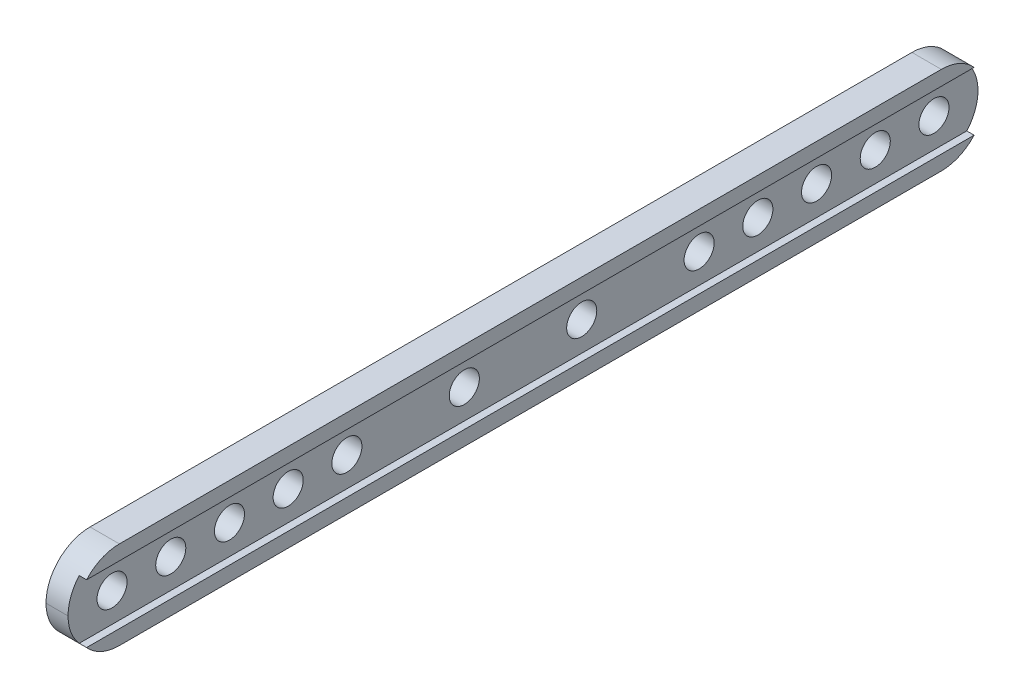
ISO-10303-21;
HEADER;
FILE_DESCRIPTION(('STEP AP214'),'2;1');
FILE_NAME('part.step','',(''),(''),'','','');
FILE_SCHEMA(('AUTOMOTIVE_DESIGN { 1 0 10303 214 1 1 1 1 }'));
ENDSEC;
DATA;
#1=APPLICATION_CONTEXT('core data for automotive mechanical design processes');
#2=APPLICATION_PROTOCOL_DEFINITION('international standard','automotive_design',2000,#1);
#3=PRODUCT_CONTEXT('',#1,'mechanical');
#4=PRODUCT('Part','Part','',(#3));
#5=PRODUCT_RELATED_PRODUCT_CATEGORY('part','',(#4));
#6=PRODUCT_DEFINITION_FORMATION('','',#4);
#7=PRODUCT_DEFINITION_CONTEXT('part definition',#1,'design');
#8=PRODUCT_DEFINITION('design','',#6,#7);
#9=PRODUCT_DEFINITION_SHAPE('','',#8);
#10=(LENGTH_UNIT() NAMED_UNIT(*) SI_UNIT(.MILLI.,.METRE.));
#11=(NAMED_UNIT(*) PLANE_ANGLE_UNIT() SI_UNIT($,.RADIAN.));
#12=(NAMED_UNIT(*) SI_UNIT($,.STERADIAN.) SOLID_ANGLE_UNIT());
#13=UNCERTAINTY_MEASURE_WITH_UNIT(LENGTH_MEASURE(1.E-05),#10,'distance_accuracy_value','');
#14=(GEOMETRIC_REPRESENTATION_CONTEXT(3) GLOBAL_UNCERTAINTY_ASSIGNED_CONTEXT((#13)) GLOBAL_UNIT_ASSIGNED_CONTEXT((#10,
#11,#12)) REPRESENTATION_CONTEXT('',''));
#15=CARTESIAN_POINT('',(0.,0.,0.));
#16=DIRECTION('',(0.,0.,1.));
#17=DIRECTION('',(1.,0.,0.));
#18=AXIS2_PLACEMENT_3D('',#15,#16,#17);
#19=CARTESIAN_POINT('',(4.,6.,-70.));
#20=DIRECTION('',(-1.,0.,0.));
#21=DIRECTION('',(0.,-1.,0.));
#22=AXIS2_PLACEMENT_3D('',#19,#20,#21);
#23=CYLINDRICAL_SURFACE('',#22,2.04999999999999);
#24=CARTESIAN_POINT('',(3.,6.,-70.));
#25=DIRECTION('',(1.,0.,0.));
#26=DIRECTION('',(0.,1.,0.));
#27=AXIS2_PLACEMENT_3D('',#24,#25,#26);
#28=CIRCLE('',#27,2.04999999999999);
#29=CARTESIAN_POINT('',(3.,8.04999999999999,-70.));
#30=VERTEX_POINT('',#29);
#31=EDGE_CURVE('E41',#30,#30,#28,.T.);
#32=ORIENTED_EDGE('',*,*,#31,.T.);
#33=EDGE_LOOP('',(#32));
#34=FACE_BOUND('',#33,.T.);
#35=CARTESIAN_POINT('',(0.,6.,-70.));
#36=DIRECTION('',(-1.,0.,0.));
#37=DIRECTION('',(0.,-1.,0.));
#38=AXIS2_PLACEMENT_3D('',#35,#36,#37);
#39=CIRCLE('',#38,2.04999999999999);
#40=CARTESIAN_POINT('',(0.,3.95000000000001,-70.));
#41=VERTEX_POINT('',#40);
#42=EDGE_CURVE('E11',#41,#41,#39,.T.);
#43=ORIENTED_EDGE('',*,*,#42,.T.);
#44=EDGE_LOOP('',(#43));
#45=FACE_BOUND('',#44,.T.);
#46=ADVANCED_FACE('F33',(#34,#45),#23,.F.);
#47=CARTESIAN_POINT('',(4.,6.,-86.));
#48=DIRECTION('',(-1.,0.,0.));
#49=DIRECTION('',(0.,-1.,0.));
#50=AXIS2_PLACEMENT_3D('',#47,#48,#49);
#51=CYLINDRICAL_SURFACE('',#50,2.04999999999999);
#52=CARTESIAN_POINT('',(3.,6.,-86.));
#53=DIRECTION('',(1.,0.,0.));
#54=DIRECTION('',(0.,1.,0.));
#55=AXIS2_PLACEMENT_3D('',#52,#53,#54);
#56=CIRCLE('',#55,2.04999999999999);
#57=CARTESIAN_POINT('',(3.,8.04999999999999,-86.));
#58=VERTEX_POINT('',#57);
#59=EDGE_CURVE('E191',#58,#58,#56,.T.);
#60=ORIENTED_EDGE('',*,*,#59,.T.);
#61=EDGE_LOOP('',(#60));
#62=FACE_BOUND('',#61,.T.);
#63=CARTESIAN_POINT('',(0.,6.,-86.));
#64=DIRECTION('',(-1.,0.,0.));
#65=DIRECTION('',(0.,-1.,0.));
#66=AXIS2_PLACEMENT_3D('',#63,#64,#65);
#67=CIRCLE('',#66,2.04999999999999);
#68=CARTESIAN_POINT('',(0.,3.95000000000001,-86.));
#69=VERTEX_POINT('',#68);
#70=EDGE_CURVE('E194',#69,#69,#67,.T.);
#71=ORIENTED_EDGE('',*,*,#70,.T.);
#72=EDGE_LOOP('',(#71));
#73=FACE_BOUND('',#72,.T.);
#74=ADVANCED_FACE('F279',(#62,#73),#51,.F.);
#75=CARTESIAN_POINT('',(4.,6.,-94.));
#76=DIRECTION('',(-1.,0.,0.));
#77=DIRECTION('',(0.,-1.,0.));
#78=AXIS2_PLACEMENT_3D('',#75,#76,#77);
#79=CYLINDRICAL_SURFACE('',#78,2.04999999999999);
#80=CARTESIAN_POINT('',(3.,6.,-94.));
#81=DIRECTION('',(1.,0.,0.));
#82=DIRECTION('',(0.,1.,0.));
#83=AXIS2_PLACEMENT_3D('',#80,#81,#82);
#84=CIRCLE('',#83,2.04999999999999);
#85=CARTESIAN_POINT('',(3.,8.04999999999999,-94.));
#86=VERTEX_POINT('',#85);
#87=EDGE_CURVE('E185',#86,#86,#84,.T.);
#88=ORIENTED_EDGE('',*,*,#87,.T.);
#89=EDGE_LOOP('',(#88));
#90=FACE_BOUND('',#89,.T.);
#91=CARTESIAN_POINT('',(0.,6.,-94.));
#92=DIRECTION('',(-1.,0.,0.));
#93=DIRECTION('',(0.,-1.,0.));
#94=AXIS2_PLACEMENT_3D('',#91,#92,#93);
#95=CIRCLE('',#94,2.04999999999999);
#96=CARTESIAN_POINT('',(0.,3.95000000000001,-94.));
#97=VERTEX_POINT('',#96);
#98=EDGE_CURVE('E188',#97,#97,#95,.T.);
#99=ORIENTED_EDGE('',*,*,#98,.T.);
#100=EDGE_LOOP('',(#99));
#101=FACE_BOUND('',#100,.T.);
#102=ADVANCED_FACE('F284',(#90,#101),#79,.F.);
#103=CARTESIAN_POINT('',(4.,6.,-102.));
#104=DIRECTION('',(-1.,0.,0.));
#105=DIRECTION('',(0.,-1.,0.));
#106=AXIS2_PLACEMENT_3D('',#103,#104,#105);
#107=CYLINDRICAL_SURFACE('',#106,2.04999999999999);
#108=CARTESIAN_POINT('',(3.,6.,-102.));
#109=DIRECTION('',(1.,0.,0.));
#110=DIRECTION('',(0.,1.,0.));
#111=AXIS2_PLACEMENT_3D('',#108,#109,#110);
#112=CIRCLE('',#111,2.04999999999999);
#113=CARTESIAN_POINT('',(3.,8.04999999999999,-102.));
#114=VERTEX_POINT('',#113);
#115=EDGE_CURVE('E172',#114,#114,#112,.T.);
#116=ORIENTED_EDGE('',*,*,#115,.T.);
#117=EDGE_LOOP('',(#116));
#118=FACE_BOUND('',#117,.T.);
#119=CARTESIAN_POINT('',(0.,6.,-102.));
#120=DIRECTION('',(-1.,0.,0.));
#121=DIRECTION('',(0.,-1.,0.));
#122=AXIS2_PLACEMENT_3D('',#119,#120,#121);
#123=CIRCLE('',#122,2.04999999999999);
#124=CARTESIAN_POINT('',(0.,3.95000000000001,-102.));
#125=VERTEX_POINT('',#124);
#126=EDGE_CURVE('E182',#125,#125,#123,.T.);
#127=ORIENTED_EDGE('',*,*,#126,.T.);
#128=EDGE_LOOP('',(#127));
#129=FACE_BOUND('',#128,.T.);
#130=ADVANCED_FACE('F292',(#118,#129),#107,.F.);
#131=CARTESIAN_POINT('',(0.,0.,-124.));
#132=DIRECTION('',(-1.,0.,0.));
#133=DIRECTION('',(0.,-1.,0.));
#134=AXIS2_PLACEMENT_3D('',#131,#132,#133);
#135=PLANE('',#134);
#136=CARTESIAN_POINT('',(0.,6.,-22.));
#137=DIRECTION('',(1.,0.,0.));
#138=DIRECTION('',(0.,-1.,0.));
#139=AXIS2_PLACEMENT_3D('',#136,#137,#138);
#140=CIRCLE('',#139,2.04999999999999);
#141=CARTESIAN_POINT('',(0.,3.95000000000001,-22.));
#142=VERTEX_POINT('',#141);
#143=EDGE_CURVE('E212',#142,#142,#140,.T.);
#144=ORIENTED_EDGE('',*,*,#143,.T.);
#145=EDGE_LOOP('',(#144));
#146=FACE_BOUND('',#145,.T.);
#147=CARTESIAN_POINT('',(0.,6.,-30.));
#148=DIRECTION('',(1.,0.,0.));
#149=DIRECTION('',(0.,-1.,0.));
#150=AXIS2_PLACEMENT_3D('',#147,#148,#149);
#151=CIRCLE('',#150,2.04999999999999);
#152=CARTESIAN_POINT('',(0.,3.95000000000001,-30.));
#153=VERTEX_POINT('',#152);
#154=EDGE_CURVE('E365',#153,#153,#151,.T.);
#155=ORIENTED_EDGE('',*,*,#154,.T.);
#156=EDGE_LOOP('',(#155));
#157=FACE_BOUND('',#156,.T.);
#158=CARTESIAN_POINT('',(0.,6.,-38.));
#159=DIRECTION('',(1.,0.,0.));
#160=DIRECTION('',(0.,-1.,0.));
#161=AXIS2_PLACEMENT_3D('',#158,#159,#160);
#162=CIRCLE('',#161,2.04999999999999);
#163=CARTESIAN_POINT('',(0.,3.95000000000001,-38.));
#164=VERTEX_POINT('',#163);
#165=EDGE_CURVE('E368',#164,#164,#162,.T.);
#166=ORIENTED_EDGE('',*,*,#165,.T.);
#167=EDGE_LOOP('',(#166));
#168=FACE_BOUND('',#167,.T.);
#169=CARTESIAN_POINT('',(0.,6.,-54.));
#170=DIRECTION('',(1.,0.,0.));
#171=DIRECTION('',(0.,-1.,0.));
#172=AXIS2_PLACEMENT_3D('',#169,#170,#171);
#173=CIRCLE('',#172,2.04999999999999);
#174=CARTESIAN_POINT('',(0.,3.95000000000001,-54.));
#175=VERTEX_POINT('',#174);
#176=EDGE_CURVE('E227',#175,#175,#173,.T.);
#177=ORIENTED_EDGE('',*,*,#176,.T.);
#178=EDGE_LOOP('',(#177));
#179=FACE_BOUND('',#178,.T.);
#180=CARTESIAN_POINT('',(0.,6.,-14.));
#181=DIRECTION('',(1.,0.,0.));
#182=DIRECTION('',(0.,-1.,0.));
#183=AXIS2_PLACEMENT_3D('',#180,#181,#182);
#184=CIRCLE('',#183,2.04999999999999);
#185=CARTESIAN_POINT('',(0.,3.95000000000001,-14.));
#186=VERTEX_POINT('',#185);
#187=EDGE_CURVE('E207',#186,#186,#184,.T.);
#188=ORIENTED_EDGE('',*,*,#187,.T.);
#189=EDGE_LOOP('',(#188));
#190=FACE_BOUND('',#189,.T.);
#191=CARTESIAN_POINT('',(0.,6.,-6.00000000000001));
#192=DIRECTION('',(1.,0.,0.));
#193=DIRECTION('',(0.,-1.,0.));
#194=AXIS2_PLACEMENT_3D('',#191,#192,#193);
#195=CIRCLE('',#194,2.04999999999999);
#196=CARTESIAN_POINT('',(0.,3.95000000000001,-6.00000000000001));
#197=VERTEX_POINT('',#196);
#198=EDGE_CURVE('E203',#197,#197,#195,.T.);
#199=ORIENTED_EDGE('',*,*,#198,.T.);
#200=EDGE_LOOP('',(#199));
#201=FACE_BOUND('',#200,.T.);
#202=CARTESIAN_POINT('',(0.,6.,-110.));
#203=DIRECTION('',(-1.,0.,0.));
#204=DIRECTION('',(0.,-1.,0.));
#205=AXIS2_PLACEMENT_3D('',#202,#203,#204);
#206=CIRCLE('',#205,2.04999999999999);
#207=CARTESIAN_POINT('',(0.,3.95000000000001,-110.));
#208=VERTEX_POINT('',#207);
#209=EDGE_CURVE('E233',#208,#208,#206,.T.);
#210=ORIENTED_EDGE('',*,*,#209,.F.);
#211=EDGE_LOOP('',(#210));
#212=FACE_BOUND('',#211,.T.);
#213=CARTESIAN_POINT('',(0.,6.,-118.));
#214=DIRECTION('',(-1.,0.,0.));
#215=DIRECTION('',(0.,-1.,0.));
#216=AXIS2_PLACEMENT_3D('',#213,#214,#215);
#217=CIRCLE('',#216,2.04999999999999);
#218=CARTESIAN_POINT('',(0.,3.95000000000001,-118.));
#219=VERTEX_POINT('',#218);
#220=EDGE_CURVE('E179',#219,#219,#217,.T.);
#221=ORIENTED_EDGE('',*,*,#220,.F.);
#222=EDGE_LOOP('',(#221));
#223=FACE_BOUND('',#222,.T.);
#224=CARTESIAN_POINT('',(0.,6.,-6.));
#225=DIRECTION('',(-1.,0.,0.));
#226=DIRECTION('',(0.,-1.,0.));
#227=AXIS2_PLACEMENT_3D('',#224,#225,#226);
#228=CIRCLE('',#227,6.);
#229=CARTESIAN_POINT('',(0.,0.,-6.00000000000001));
#230=VERTEX_POINT('',#229);
#231=CARTESIAN_POINT('',(0.,6.,0.));
#232=VERTEX_POINT('',#231);
#233=EDGE_CURVE('E114',#230,#232,#228,.T.);
#234=ORIENTED_EDGE('',*,*,#233,.T.);
#235=CARTESIAN_POINT('',(0.,6.,-6.));
#236=DIRECTION('',(-1.,0.,0.));
#237=DIRECTION('',(0.,-1.,0.));
#238=AXIS2_PLACEMENT_3D('',#235,#236,#237);
#239=CIRCLE('',#238,6.);
#240=CARTESIAN_POINT('',(0.,12.,-6.00000000000001));
#241=VERTEX_POINT('',#240);
#242=EDGE_CURVE('E120',#232,#241,#239,.T.);
#243=ORIENTED_EDGE('',*,*,#242,.T.);
#244=DIRECTION('',(0.,0.,1.));
#245=VECTOR('',#244,1.);
#246=CARTESIAN_POINT('',(0.,12.,-124.));
#247=LINE('',#246,#245);
#248=CARTESIAN_POINT('',(0.,12.,-118.));
#249=VERTEX_POINT('',#248);
#250=EDGE_CURVE('E238',#249,#241,#247,.T.);
#251=ORIENTED_EDGE('',*,*,#250,.F.);
#252=CARTESIAN_POINT('',(0.,6.,-118.));
#253=DIRECTION('',(-1.,0.,0.));
#254=DIRECTION('',(0.,-1.,0.));
#255=AXIS2_PLACEMENT_3D('',#252,#253,#254);
#256=CIRCLE('',#255,6.);
#257=CARTESIAN_POINT('',(0.,6.,-124.));
#258=VERTEX_POINT('',#257);
#259=EDGE_CURVE('E240',#249,#258,#256,.T.);
#260=ORIENTED_EDGE('',*,*,#259,.T.);
#261=CARTESIAN_POINT('',(0.,6.,-118.));
#262=DIRECTION('',(-1.,0.,0.));
#263=DIRECTION('',(0.,-1.,0.));
#264=AXIS2_PLACEMENT_3D('',#261,#262,#263);
#265=CIRCLE('',#264,6.);
#266=CARTESIAN_POINT('',(0.,0.,-118.));
#267=VERTEX_POINT('',#266);
#268=EDGE_CURVE('E126',#258,#267,#265,.T.);
#269=ORIENTED_EDGE('',*,*,#268,.T.);
#270=DIRECTION('',(0.,0.,1.));
#271=VECTOR('',#270,1.);
#272=CARTESIAN_POINT('',(0.,0.,-124.));
#273=LINE('',#272,#271);
#274=EDGE_CURVE('E123',#267,#230,#273,.T.);
#275=ORIENTED_EDGE('',*,*,#274,.T.);
#276=EDGE_LOOP('',(#234,#243,#251,#260,#269,#275));
#277=FACE_BOUND('',#276,.T.);
#278=ORIENTED_EDGE('',*,*,#126,.F.);
#279=EDGE_LOOP('',(#278));
#280=FACE_BOUND('',#279,.T.);
#281=ORIENTED_EDGE('',*,*,#98,.F.);
#282=EDGE_LOOP('',(#281));
#283=FACE_BOUND('',#282,.T.);
#284=ORIENTED_EDGE('',*,*,#70,.F.);
#285=EDGE_LOOP('',(#284));
#286=FACE_BOUND('',#285,.T.);
#287=ORIENTED_EDGE('',*,*,#42,.F.);
#288=EDGE_LOOP('',(#287));
#289=FACE_BOUND('',#288,.T.);
#290=ADVANCED_FACE('F116',(#146,#157,#168,#179,#190,#201,#212,#223,#277,#280,#283,#286,#289),
#135,.T.);
#291=CARTESIAN_POINT('',(0.,12.,-124.));
#292=DIRECTION('',(0.,1.,0.));
#293=DIRECTION('',(0.,0.,1.));
#294=AXIS2_PLACEMENT_3D('',#291,#292,#293);
#295=PLANE('',#294);
#296=ORIENTED_EDGE('',*,*,#250,.T.);
#297=DIRECTION('',(-1.,0.,0.));
#298=VECTOR('',#297,1.);
#299=CARTESIAN_POINT('',(4.,12.,-6.));
#300=LINE('',#299,#298);
#301=CARTESIAN_POINT('',(4.,12.,-6.00000000000001));
#302=VERTEX_POINT('',#301);
#303=EDGE_CURVE('E141',#241,#302,#300,.F.);
#304=ORIENTED_EDGE('',*,*,#303,.T.);
#305=DIRECTION('',(0.,0.,1.));
#306=VECTOR('',#305,1.);
#307=CARTESIAN_POINT('',(4.,12.,-124.));
#308=LINE('',#307,#306);
#309=CARTESIAN_POINT('',(4.,12.,-118.));
#310=VERTEX_POINT('',#309);
#311=EDGE_CURVE('E241',#310,#302,#308,.T.);
#312=ORIENTED_EDGE('',*,*,#311,.F.);
#313=DIRECTION('',(-1.,0.,0.));
#314=VECTOR('',#313,1.);
#315=CARTESIAN_POINT('',(0.,12.,-118.));
#316=LINE('',#315,#314);
#317=EDGE_CURVE('E142',#310,#249,#316,.T.);
#318=ORIENTED_EDGE('',*,*,#317,.T.);
#319=EDGE_LOOP('',(#296,#304,#312,#318));
#320=FACE_BOUND('',#319,.T.);
#321=ADVANCED_FACE('F291',(#320),#295,.T.);
#322=CARTESIAN_POINT('',(4.,10.,-124.));
#323=DIRECTION('',(1.,0.,0.));
#324=DIRECTION('',(0.,1.,0.));
#325=AXIS2_PLACEMENT_3D('',#322,#323,#324);
#326=PLANE('',#325);
#327=ORIENTED_EDGE('',*,*,#311,.T.);
#328=CARTESIAN_POINT('',(4.,6.,-6.));
#329=DIRECTION('',(1.,0.,0.));
#330=DIRECTION('',(0.,1.,0.));
#331=AXIS2_PLACEMENT_3D('',#328,#329,#330);
#332=CIRCLE('',#331,6.);
#333=CARTESIAN_POINT('',(4.,10.,-1.52786404500042));
#334=VERTEX_POINT('',#333);
#335=EDGE_CURVE('E150',#302,#334,#332,.T.);
#336=ORIENTED_EDGE('',*,*,#335,.T.);
#337=DIRECTION('',(0.,0.,1.));
#338=VECTOR('',#337,1.);
#339=CARTESIAN_POINT('',(4.,10.,-124.));
#340=LINE('',#339,#338);
#341=CARTESIAN_POINT('',(4.,10.,-122.472135955));
#342=VERTEX_POINT('',#341);
#343=EDGE_CURVE('E244',#342,#334,#340,.T.);
#344=ORIENTED_EDGE('',*,*,#343,.F.);
#345=CARTESIAN_POINT('',(4.,6.,-118.));
#346=DIRECTION('',(1.,0.,0.));
#347=DIRECTION('',(0.,1.,0.));
#348=AXIS2_PLACEMENT_3D('',#345,#346,#347);
#349=CIRCLE('',#348,6.);
#350=EDGE_CURVE('E148',#342,#310,#349,.T.);
#351=ORIENTED_EDGE('',*,*,#350,.T.);
#352=EDGE_LOOP('',(#327,#336,#344,#351));
#353=FACE_BOUND('',#352,.T.);
#354=ADVANCED_FACE('F299',(#353),#326,.T.);
#355=CARTESIAN_POINT('',(4.,10.,-124.));
#356=DIRECTION('',(0.,-1.,0.));
#357=DIRECTION('',(1.,0.,0.));
#358=AXIS2_PLACEMENT_3D('',#355,#356,#357);
#359=PLANE('',#358);
#360=ORIENTED_EDGE('',*,*,#343,.T.);
#361=DIRECTION('',(1.,0.,0.));
#362=VECTOR('',#361,1.);
#363=CARTESIAN_POINT('',(4.,10.,-1.52786404500043));
#364=LINE('',#363,#362);
#365=CARTESIAN_POINT('',(3.,10.,-1.52786404500042));
#366=VERTEX_POINT('',#365);
#367=EDGE_CURVE('E154',#334,#366,#364,.F.);
#368=ORIENTED_EDGE('',*,*,#367,.T.);
#369=DIRECTION('',(0.,0.,1.));
#370=VECTOR('',#369,1.);
#371=CARTESIAN_POINT('',(3.,10.,-124.));
#372=LINE('',#371,#370);
#373=CARTESIAN_POINT('',(3.,10.,-122.472135955));
#374=VERTEX_POINT('',#373);
#375=EDGE_CURVE('E247',#374,#366,#372,.T.);
#376=ORIENTED_EDGE('',*,*,#375,.F.);
#377=DIRECTION('',(-1.,0.,0.));
#378=VECTOR('',#377,1.);
#379=CARTESIAN_POINT('',(3.,10.,-122.472135955));
#380=LINE('',#379,#378);
#381=EDGE_CURVE('E152',#374,#342,#380,.F.);
#382=ORIENTED_EDGE('',*,*,#381,.T.);
#383=EDGE_LOOP('',(#360,#368,#376,#382));
#384=FACE_BOUND('',#383,.T.);
#385=ADVANCED_FACE('F328',(#384),#359,.T.);
#386=CARTESIAN_POINT('',(3.,10.,-124.));
#387=DIRECTION('',(1.,0.,0.));
#388=DIRECTION('',(0.,1.,0.));
#389=AXIS2_PLACEMENT_3D('',#386,#387,#388);
#390=PLANE('',#389);
#391=CARTESIAN_POINT('',(3.,6.,-22.));
#392=DIRECTION('',(1.,0.,0.));
#393=DIRECTION('',(0.,1.,0.));
#394=AXIS2_PLACEMENT_3D('',#391,#392,#393);
#395=CIRCLE('',#394,2.04999999999999);
#396=CARTESIAN_POINT('',(3.,8.04999999999999,-22.));
#397=VERTEX_POINT('',#396);
#398=EDGE_CURVE('E36',#397,#397,#395,.F.);
#399=ORIENTED_EDGE('',*,*,#398,.T.);
#400=EDGE_LOOP('',(#399));
#401=FACE_BOUND('',#400,.T.);
#402=CARTESIAN_POINT('',(3.,6.,-30.));
#403=DIRECTION('',(1.,0.,0.));
#404=DIRECTION('',(0.,1.,0.));
#405=AXIS2_PLACEMENT_3D('',#402,#403,#404);
#406=CIRCLE('',#405,2.04999999999999);
#407=CARTESIAN_POINT('',(3.,8.04999999999999,-30.));
#408=VERTEX_POINT('',#407);
#409=EDGE_CURVE('E214',#408,#408,#406,.F.);
#410=ORIENTED_EDGE('',*,*,#409,.T.);
#411=EDGE_LOOP('',(#410));
#412=FACE_BOUND('',#411,.T.);
#413=CARTESIAN_POINT('',(3.,6.,-38.));
#414=DIRECTION('',(1.,0.,0.));
#415=DIRECTION('',(0.,1.,0.));
#416=AXIS2_PLACEMENT_3D('',#413,#414,#415);
#417=CIRCLE('',#416,2.04999999999999);
#418=CARTESIAN_POINT('',(3.,8.04999999999999,-38.));
#419=VERTEX_POINT('',#418);
#420=EDGE_CURVE('E211',#419,#419,#417,.F.);
#421=ORIENTED_EDGE('',*,*,#420,.T.);
#422=EDGE_LOOP('',(#421));
#423=FACE_BOUND('',#422,.T.);
#424=CARTESIAN_POINT('',(3.,6.,-54.));
#425=DIRECTION('',(1.,0.,0.));
#426=DIRECTION('',(0.,1.,0.));
#427=AXIS2_PLACEMENT_3D('',#424,#425,#426);
#428=CIRCLE('',#427,2.04999999999999);
#429=CARTESIAN_POINT('',(3.,8.04999999999999,-54.));
#430=VERTEX_POINT('',#429);
#431=EDGE_CURVE('E208',#430,#430,#428,.F.);
#432=ORIENTED_EDGE('',*,*,#431,.T.);
#433=EDGE_LOOP('',(#432));
#434=FACE_BOUND('',#433,.T.);
#435=CARTESIAN_POINT('',(3.,6.,-14.));
#436=DIRECTION('',(1.,0.,0.));
#437=DIRECTION('',(0.,1.,0.));
#438=AXIS2_PLACEMENT_3D('',#435,#436,#437);
#439=CIRCLE('',#438,2.04999999999999);
#440=CARTESIAN_POINT('',(3.,8.04999999999999,-14.));
#441=VERTEX_POINT('',#440);
#442=EDGE_CURVE('E204',#441,#441,#439,.F.);
#443=ORIENTED_EDGE('',*,*,#442,.T.);
#444=EDGE_LOOP('',(#443));
#445=FACE_BOUND('',#444,.T.);
#446=CARTESIAN_POINT('',(3.,6.,-6.00000000000001));
#447=DIRECTION('',(1.,0.,0.));
#448=DIRECTION('',(0.,1.,0.));
#449=AXIS2_PLACEMENT_3D('',#446,#447,#448);
#450=CIRCLE('',#449,2.04999999999999);
#451=CARTESIAN_POINT('',(3.,8.04999999999999,-6.00000000000001));
#452=VERTEX_POINT('',#451);
#453=EDGE_CURVE('E199',#452,#452,#450,.F.);
#454=ORIENTED_EDGE('',*,*,#453,.T.);
#455=EDGE_LOOP('',(#454));
#456=FACE_BOUND('',#455,.T.);
#457=CARTESIAN_POINT('',(3.,6.,-110.));
#458=DIRECTION('',(1.,0.,0.));
#459=DIRECTION('',(0.,1.,0.));
#460=AXIS2_PLACEMENT_3D('',#457,#458,#459);
#461=CIRCLE('',#460,2.04999999999999);
#462=CARTESIAN_POINT('',(3.,8.04999999999999,-110.));
#463=VERTEX_POINT('',#462);
#464=EDGE_CURVE('E202',#463,#463,#461,.T.);
#465=ORIENTED_EDGE('',*,*,#464,.F.);
#466=EDGE_LOOP('',(#465));
#467=FACE_BOUND('',#466,.T.);
#468=CARTESIAN_POINT('',(3.,6.,-118.));
#469=DIRECTION('',(1.,0.,0.));
#470=DIRECTION('',(0.,1.,0.));
#471=AXIS2_PLACEMENT_3D('',#468,#469,#470);
#472=CIRCLE('',#471,2.04999999999999);
#473=CARTESIAN_POINT('',(3.,8.04999999999999,-118.));
#474=VERTEX_POINT('',#473);
#475=EDGE_CURVE('E176',#474,#474,#472,.T.);
#476=ORIENTED_EDGE('',*,*,#475,.F.);
#477=EDGE_LOOP('',(#476));
#478=FACE_BOUND('',#477,.T.);
#479=ORIENTED_EDGE('',*,*,#375,.T.);
#480=CARTESIAN_POINT('',(3.,6.,-6.));
#481=DIRECTION('',(1.,0.,0.));
#482=DIRECTION('',(0.,1.,0.));
#483=AXIS2_PLACEMENT_3D('',#480,#481,#482);
#484=CIRCLE('',#483,6.);
#485=CARTESIAN_POINT('',(3.,6.,0.));
#486=VERTEX_POINT('',#485);
#487=EDGE_CURVE('E161',#366,#486,#484,.T.);
#488=ORIENTED_EDGE('',*,*,#487,.T.);
#489=CARTESIAN_POINT('',(3.,6.,-6.));
#490=DIRECTION('',(1.,0.,0.));
#491=DIRECTION('',(0.,1.,0.));
#492=AXIS2_PLACEMENT_3D('',#489,#490,#491);
#493=CIRCLE('',#492,6.);
#494=CARTESIAN_POINT('',(3.,2.,-1.52786404500042));
#495=VERTEX_POINT('',#494);
#496=EDGE_CURVE('E133',#486,#495,#493,.T.);
#497=ORIENTED_EDGE('',*,*,#496,.T.);
#498=DIRECTION('',(0.,0.,1.));
#499=VECTOR('',#498,1.);
#500=CARTESIAN_POINT('',(3.,2.,-124.));
#501=LINE('',#500,#499);
#502=CARTESIAN_POINT('',(3.,2.,-122.472135955));
#503=VERTEX_POINT('',#502);
#504=EDGE_CURVE('E250',#503,#495,#501,.T.);
#505=ORIENTED_EDGE('',*,*,#504,.F.);
#506=CARTESIAN_POINT('',(3.,6.,-118.));
#507=DIRECTION('',(1.,0.,0.));
#508=DIRECTION('',(0.,1.,0.));
#509=AXIS2_PLACEMENT_3D('',#506,#507,#508);
#510=CIRCLE('',#509,6.);
#511=CARTESIAN_POINT('',(3.,6.,-124.));
#512=VERTEX_POINT('',#511);
#513=EDGE_CURVE('E158',#503,#512,#510,.T.);
#514=ORIENTED_EDGE('',*,*,#513,.T.);
#515=CARTESIAN_POINT('',(3.,6.,-118.));
#516=DIRECTION('',(1.,0.,0.));
#517=DIRECTION('',(0.,1.,0.));
#518=AXIS2_PLACEMENT_3D('',#515,#516,#517);
#519=CIRCLE('',#518,6.);
#520=EDGE_CURVE('E156',#512,#374,#519,.T.);
#521=ORIENTED_EDGE('',*,*,#520,.T.);
#522=EDGE_LOOP('',(#479,#488,#497,#505,#514,#521));
#523=FACE_BOUND('',#522,.T.);
#524=ORIENTED_EDGE('',*,*,#115,.F.);
#525=EDGE_LOOP('',(#524));
#526=FACE_BOUND('',#525,.T.);
#527=ORIENTED_EDGE('',*,*,#87,.F.);
#528=EDGE_LOOP('',(#527));
#529=FACE_BOUND('',#528,.T.);
#530=ORIENTED_EDGE('',*,*,#59,.F.);
#531=EDGE_LOOP('',(#530));
#532=FACE_BOUND('',#531,.T.);
#533=ORIENTED_EDGE('',*,*,#31,.F.);
#534=EDGE_LOOP('',(#533));
#535=FACE_BOUND('',#534,.T.);
#536=ADVANCED_FACE('F322',(#401,#412,#423,#434,#445,#456,#467,#478,#523,#526,#529,#532,#535),
#390,.T.);
#537=CARTESIAN_POINT('',(4.,2.,-124.));
#538=DIRECTION('',(0.,1.,0.));
#539=DIRECTION('',(-1.,0.,0.));
#540=AXIS2_PLACEMENT_3D('',#537,#538,#539);
#541=PLANE('',#540);
#542=ORIENTED_EDGE('',*,*,#504,.T.);
#543=DIRECTION('',(-1.,0.,0.));
#544=VECTOR('',#543,1.);
#545=CARTESIAN_POINT('',(3.,2.,-1.52786404500043));
#546=LINE('',#545,#544);
#547=CARTESIAN_POINT('',(4.,2.,-1.52786404500042));
#548=VERTEX_POINT('',#547);
#549=EDGE_CURVE('E165',#495,#548,#546,.F.);
#550=ORIENTED_EDGE('',*,*,#549,.T.);
#551=DIRECTION('',(0.,0.,1.));
#552=VECTOR('',#551,1.);
#553=CARTESIAN_POINT('',(4.,2.,-124.));
#554=LINE('',#553,#552);
#555=CARTESIAN_POINT('',(4.,2.,-122.472135955));
#556=VERTEX_POINT('',#555);
#557=EDGE_CURVE('E253',#556,#548,#554,.T.);
#558=ORIENTED_EDGE('',*,*,#557,.F.);
#559=DIRECTION('',(1.,0.,0.));
#560=VECTOR('',#559,1.);
#561=CARTESIAN_POINT('',(4.,2.,-122.472135955));
#562=LINE('',#561,#560);
#563=EDGE_CURVE('E163',#556,#503,#562,.F.);
#564=ORIENTED_EDGE('',*,*,#563,.T.);
#565=EDGE_LOOP('',(#542,#550,#558,#564));
#566=FACE_BOUND('',#565,.T.);
#567=ADVANCED_FACE('F318',(#566),#541,.T.);
#568=CARTESIAN_POINT('',(4.,0.,-124.));
#569=DIRECTION('',(1.,0.,0.));
#570=DIRECTION('',(0.,1.,0.));
#571=AXIS2_PLACEMENT_3D('',#568,#569,#570);
#572=PLANE('',#571);
#573=ORIENTED_EDGE('',*,*,#557,.T.);
#574=CARTESIAN_POINT('',(4.,6.,-6.));
#575=DIRECTION('',(1.,0.,0.));
#576=DIRECTION('',(0.,1.,0.));
#577=AXIS2_PLACEMENT_3D('',#574,#575,#576);
#578=CIRCLE('',#577,6.);
#579=CARTESIAN_POINT('',(4.,0.,-6.00000000000001));
#580=VERTEX_POINT('',#579);
#581=EDGE_CURVE('E49',#548,#580,#578,.T.);
#582=ORIENTED_EDGE('',*,*,#581,.T.);
#583=DIRECTION('',(0.,0.,1.));
#584=VECTOR('',#583,1.);
#585=CARTESIAN_POINT('',(4.,0.,-124.));
#586=LINE('',#585,#584);
#587=CARTESIAN_POINT('',(4.,0.,-118.));
#588=VERTEX_POINT('',#587);
#589=EDGE_CURVE('E255',#588,#580,#586,.T.);
#590=ORIENTED_EDGE('',*,*,#589,.F.);
#591=CARTESIAN_POINT('',(4.,6.,-118.));
#592=DIRECTION('',(1.,0.,0.));
#593=DIRECTION('',(0.,1.,0.));
#594=AXIS2_PLACEMENT_3D('',#591,#592,#593);
#595=CIRCLE('',#594,6.);
#596=EDGE_CURVE('E57',#588,#556,#595,.T.);
#597=ORIENTED_EDGE('',*,*,#596,.T.);
#598=EDGE_LOOP('',(#573,#582,#590,#597));
#599=FACE_BOUND('',#598,.T.);
#600=ADVANCED_FACE('F314',(#599),#572,.T.);
#601=CARTESIAN_POINT('',(0.,0.,-124.));
#602=DIRECTION('',(0.,-1.,0.));
#603=DIRECTION('',(0.,0.,-1.));
#604=AXIS2_PLACEMENT_3D('',#601,#602,#603);
#605=PLANE('',#604);
#606=ORIENTED_EDGE('',*,*,#589,.T.);
#607=DIRECTION('',(1.,0.,0.));
#608=VECTOR('',#607,1.);
#609=CARTESIAN_POINT('',(0.,0.,-6.));
#610=LINE('',#609,#608);
#611=EDGE_CURVE('E171',#580,#230,#610,.F.);
#612=ORIENTED_EDGE('',*,*,#611,.T.);
#613=ORIENTED_EDGE('',*,*,#274,.F.);
#614=DIRECTION('',(1.,0.,0.));
#615=VECTOR('',#614,1.);
#616=CARTESIAN_POINT('',(0.,0.,-118.));
#617=LINE('',#616,#615);
#618=EDGE_CURVE('E169',#267,#588,#617,.T.);
#619=ORIENTED_EDGE('',*,*,#618,.T.);
#620=EDGE_LOOP('',(#606,#612,#613,#619));
#621=FACE_BOUND('',#620,.T.);
#622=ADVANCED_FACE('F262',(#621),#605,.T.);
#623=CARTESIAN_POINT('',(0.,6.,-6.));
#624=DIRECTION('',(-1.,0.,0.));
#625=DIRECTION('',(0.,0.,1.));
#626=AXIS2_PLACEMENT_3D('',#623,#624,#625);
#627=CYLINDRICAL_SURFACE('',#626,6.);
#628=ORIENTED_EDGE('',*,*,#549,.F.);
#629=ORIENTED_EDGE('',*,*,#496,.F.);
#630=DIRECTION('',(1.,0.,0.));
#631=VECTOR('',#630,1.);
#632=CARTESIAN_POINT('',(4.,6.,0.));
#633=LINE('',#632,#631);
#634=EDGE_CURVE('E130',#232,#486,#633,.T.);
#635=ORIENTED_EDGE('',*,*,#634,.F.);
#636=ORIENTED_EDGE('',*,*,#233,.F.);
#637=ORIENTED_EDGE('',*,*,#611,.F.);
#638=ORIENTED_EDGE('',*,*,#581,.F.);
#639=EDGE_LOOP('',(#628,#629,#635,#636,#637,#638));
#640=FACE_BOUND('',#639,.T.);
#641=ADVANCED_FACE('F132',(#640),#627,.T.);
#642=CARTESIAN_POINT('',(0.,6.,-6.));
#643=DIRECTION('',(1.,0.,0.));
#644=DIRECTION('',(0.,0.,-1.));
#645=AXIS2_PLACEMENT_3D('',#642,#643,#644);
#646=CYLINDRICAL_SURFACE('',#645,6.);
#647=ORIENTED_EDGE('',*,*,#335,.F.);
#648=ORIENTED_EDGE('',*,*,#303,.F.);
#649=ORIENTED_EDGE('',*,*,#242,.F.);
#650=ORIENTED_EDGE('',*,*,#634,.T.);
#651=ORIENTED_EDGE('',*,*,#487,.F.);
#652=ORIENTED_EDGE('',*,*,#367,.F.);
#653=EDGE_LOOP('',(#647,#648,#649,#650,#651,#652));
#654=FACE_BOUND('',#653,.T.);
#655=ADVANCED_FACE('F139',(#654),#646,.T.);
#656=CARTESIAN_POINT('',(0.,6.,-118.));
#657=DIRECTION('',(-1.,0.,0.));
#658=DIRECTION('',(0.,0.,1.));
#659=AXIS2_PLACEMENT_3D('',#656,#657,#658);
#660=CYLINDRICAL_SURFACE('',#659,6.);
#661=DIRECTION('',(-1.,0.,0.));
#662=VECTOR('',#661,1.);
#663=CARTESIAN_POINT('',(0.,6.,-124.));
#664=LINE('',#663,#662);
#665=EDGE_CURVE('E136',#258,#512,#664,.F.);
#666=ORIENTED_EDGE('',*,*,#665,.F.);
#667=ORIENTED_EDGE('',*,*,#259,.F.);
#668=ORIENTED_EDGE('',*,*,#317,.F.);
#669=ORIENTED_EDGE('',*,*,#350,.F.);
#670=ORIENTED_EDGE('',*,*,#381,.F.);
#671=ORIENTED_EDGE('',*,*,#520,.F.);
#672=EDGE_LOOP('',(#666,#667,#668,#669,#670,#671));
#673=FACE_BOUND('',#672,.T.);
#674=ADVANCED_FACE('F266',(#673),#660,.T.);
#675=CARTESIAN_POINT('',(0.,6.,-118.));
#676=DIRECTION('',(1.,0.,0.));
#677=DIRECTION('',(0.,0.,-1.));
#678=AXIS2_PLACEMENT_3D('',#675,#676,#677);
#679=CYLINDRICAL_SURFACE('',#678,6.);
#680=ORIENTED_EDGE('',*,*,#268,.F.);
#681=ORIENTED_EDGE('',*,*,#665,.T.);
#682=ORIENTED_EDGE('',*,*,#513,.F.);
#683=ORIENTED_EDGE('',*,*,#563,.F.);
#684=ORIENTED_EDGE('',*,*,#596,.F.);
#685=ORIENTED_EDGE('',*,*,#618,.F.);
#686=EDGE_LOOP('',(#680,#681,#682,#683,#684,#685));
#687=FACE_BOUND('',#686,.T.);
#688=ADVANCED_FACE('F263',(#687),#679,.T.);
#689=CARTESIAN_POINT('',(4.,6.,-118.));
#690=DIRECTION('',(-1.,0.,0.));
#691=DIRECTION('',(0.,-1.,0.));
#692=AXIS2_PLACEMENT_3D('',#689,#690,#691);
#693=CYLINDRICAL_SURFACE('',#692,2.04999999999999);
#694=ORIENTED_EDGE('',*,*,#475,.T.);
#695=EDGE_LOOP('',(#694));
#696=FACE_BOUND('',#695,.T.);
#697=ORIENTED_EDGE('',*,*,#220,.T.);
#698=EDGE_LOOP('',(#697));
#699=FACE_BOUND('',#698,.T.);
#700=ADVANCED_FACE('F265',(#696,#699),#693,.F.);
#701=CARTESIAN_POINT('',(4.,6.,-110.));
#702=DIRECTION('',(-1.,0.,0.));
#703=DIRECTION('',(0.,-1.,0.));
#704=AXIS2_PLACEMENT_3D('',#701,#702,#703);
#705=CYLINDRICAL_SURFACE('',#704,2.04999999999999);
#706=ORIENTED_EDGE('',*,*,#464,.T.);
#707=EDGE_LOOP('',(#706));
#708=FACE_BOUND('',#707,.T.);
#709=ORIENTED_EDGE('',*,*,#209,.T.);
#710=EDGE_LOOP('',(#709));
#711=FACE_BOUND('',#710,.T.);
#712=ADVANCED_FACE('F272',(#708,#711),#705,.F.);
#713=CARTESIAN_POINT('',(4.,6.,-6.00000000000001));
#714=DIRECTION('',(-1.,0.,0.));
#715=DIRECTION('',(0.,-1.,0.));
#716=AXIS2_PLACEMENT_3D('',#713,#714,#715);
#717=CYLINDRICAL_SURFACE('',#716,2.04999999999999);
#718=ORIENTED_EDGE('',*,*,#453,.F.);
#719=EDGE_LOOP('',(#718));
#720=FACE_BOUND('',#719,.T.);
#721=ORIENTED_EDGE('',*,*,#198,.F.);
#722=EDGE_LOOP('',(#721));
#723=FACE_BOUND('',#722,.T.);
#724=ADVANCED_FACE('F337',(#720,#723),#717,.F.);
#725=CARTESIAN_POINT('',(4.,6.,-14.));
#726=DIRECTION('',(-1.,0.,0.));
#727=DIRECTION('',(0.,-1.,0.));
#728=AXIS2_PLACEMENT_3D('',#725,#726,#727);
#729=CYLINDRICAL_SURFACE('',#728,2.04999999999999);
#730=ORIENTED_EDGE('',*,*,#442,.F.);
#731=EDGE_LOOP('',(#730));
#732=FACE_BOUND('',#731,.T.);
#733=ORIENTED_EDGE('',*,*,#187,.F.);
#734=EDGE_LOOP('',(#733));
#735=FACE_BOUND('',#734,.T.);
#736=ADVANCED_FACE('F341',(#732,#735),#729,.F.);
#737=CARTESIAN_POINT('',(4.,6.,-54.));
#738=DIRECTION('',(-1.,0.,0.));
#739=DIRECTION('',(0.,-1.,0.));
#740=AXIS2_PLACEMENT_3D('',#737,#738,#739);
#741=CYLINDRICAL_SURFACE('',#740,2.04999999999999);
#742=ORIENTED_EDGE('',*,*,#431,.F.);
#743=EDGE_LOOP('',(#742));
#744=FACE_BOUND('',#743,.T.);
#745=ORIENTED_EDGE('',*,*,#176,.F.);
#746=EDGE_LOOP('',(#745));
#747=FACE_BOUND('',#746,.T.);
#748=ADVANCED_FACE('F345',(#744,#747),#741,.F.);
#749=CARTESIAN_POINT('',(4.,6.,-38.));
#750=DIRECTION('',(-1.,0.,0.));
#751=DIRECTION('',(0.,-1.,0.));
#752=AXIS2_PLACEMENT_3D('',#749,#750,#751);
#753=CYLINDRICAL_SURFACE('',#752,2.04999999999999);
#754=ORIENTED_EDGE('',*,*,#420,.F.);
#755=EDGE_LOOP('',(#754));
#756=FACE_BOUND('',#755,.T.);
#757=ORIENTED_EDGE('',*,*,#165,.F.);
#758=EDGE_LOOP('',(#757));
#759=FACE_BOUND('',#758,.T.);
#760=ADVANCED_FACE('F349',(#756,#759),#753,.F.);
#761=CARTESIAN_POINT('',(4.,6.,-30.));
#762=DIRECTION('',(-1.,0.,0.));
#763=DIRECTION('',(0.,-1.,0.));
#764=AXIS2_PLACEMENT_3D('',#761,#762,#763);
#765=CYLINDRICAL_SURFACE('',#764,2.04999999999999);
#766=ORIENTED_EDGE('',*,*,#409,.F.);
#767=EDGE_LOOP('',(#766));
#768=FACE_BOUND('',#767,.T.);
#769=ORIENTED_EDGE('',*,*,#154,.F.);
#770=EDGE_LOOP('',(#769));
#771=FACE_BOUND('',#770,.T.);
#772=ADVANCED_FACE('F353',(#768,#771),#765,.F.);
#773=CARTESIAN_POINT('',(4.,6.,-22.));
#774=DIRECTION('',(-1.,0.,0.));
#775=DIRECTION('',(0.,-1.,0.));
#776=AXIS2_PLACEMENT_3D('',#773,#774,#775);
#777=CYLINDRICAL_SURFACE('',#776,2.04999999999999);
#778=ORIENTED_EDGE('',*,*,#398,.F.);
#779=EDGE_LOOP('',(#778));
#780=FACE_BOUND('',#779,.T.);
#781=ORIENTED_EDGE('',*,*,#143,.F.);
#782=EDGE_LOOP('',(#781));
#783=FACE_BOUND('',#782,.T.);
#784=ADVANCED_FACE('F357',(#780,#783),#777,.F.);
#785=CLOSED_SHELL('',(#46,#74,#102,#130,#290,#321,#354,#385,#536,#567,#600,#622,#641,#655,#674,
#688,#700,#712,#724,#736,#748,#760,#772,#784));
#786=MANIFOLD_SOLID_BREP('B2',#785);
#787=ADVANCED_BREP_SHAPE_REPRESENTATION('',(#18,#786),#14);
#788=SHAPE_DEFINITION_REPRESENTATION(#9,#787);
ENDSEC;
END-ISO-10303-21;
